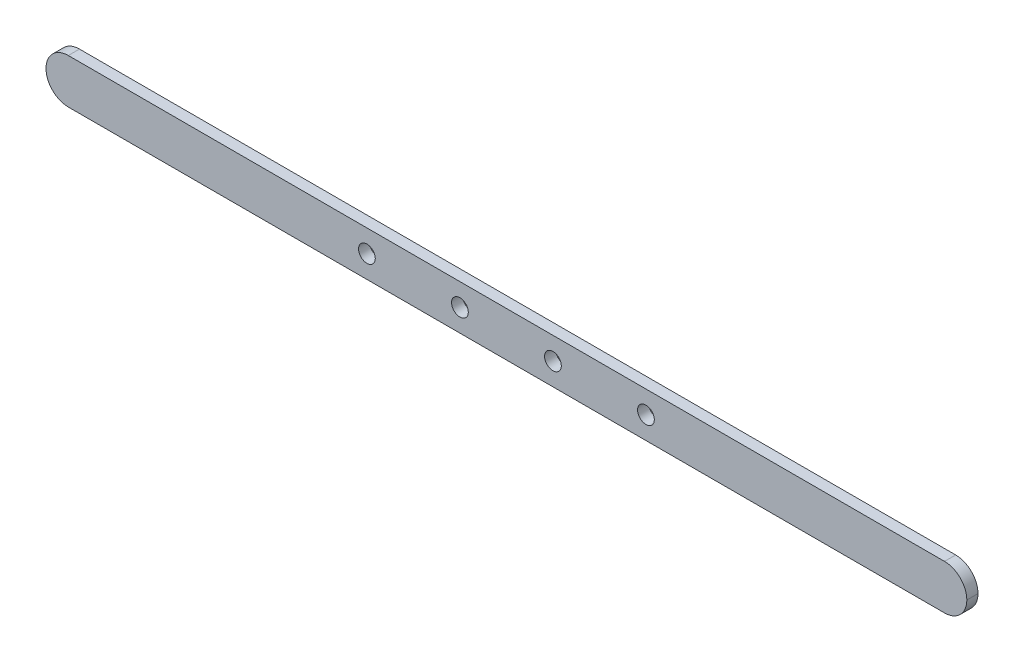
ISO-10303-21;
HEADER;
FILE_DESCRIPTION(('STEP AP214'),'2;1');
FILE_NAME('part.step','',(''),(''),'','','');
FILE_SCHEMA(('AUTOMOTIVE_DESIGN { 1 0 10303 214 1 1 1 1 }'));
ENDSEC;
DATA;
#1=APPLICATION_CONTEXT('core data for automotive mechanical design processes');
#2=APPLICATION_PROTOCOL_DEFINITION('international standard','automotive_design',2000,#1);
#3=PRODUCT_CONTEXT('',#1,'mechanical');
#4=PRODUCT('Part','Part','',(#3));
#5=PRODUCT_RELATED_PRODUCT_CATEGORY('part','',(#4));
#6=PRODUCT_DEFINITION_FORMATION('','',#4);
#7=PRODUCT_DEFINITION_CONTEXT('part definition',#1,'design');
#8=PRODUCT_DEFINITION('design','',#6,#7);
#9=PRODUCT_DEFINITION_SHAPE('','',#8);
#10=(LENGTH_UNIT() NAMED_UNIT(*) SI_UNIT(.MILLI.,.METRE.));
#11=(NAMED_UNIT(*) PLANE_ANGLE_UNIT() SI_UNIT($,.RADIAN.));
#12=(NAMED_UNIT(*) SI_UNIT($,.STERADIAN.) SOLID_ANGLE_UNIT());
#13=UNCERTAINTY_MEASURE_WITH_UNIT(LENGTH_MEASURE(1.E-05),#10,'distance_accuracy_value','');
#14=(GEOMETRIC_REPRESENTATION_CONTEXT(3) GLOBAL_UNCERTAINTY_ASSIGNED_CONTEXT((#13)) GLOBAL_UNIT_ASSIGNED_CONTEXT((#10,
#11,#12)) REPRESENTATION_CONTEXT('',''));
#15=CARTESIAN_POINT('',(0.,0.,0.));
#16=DIRECTION('',(0.,0.,1.));
#17=DIRECTION('',(1.,0.,0.));
#18=AXIS2_PLACEMENT_3D('',#15,#16,#17);
#19=CARTESIAN_POINT('',(0.,-12.,6.));
#20=DIRECTION('',(0.,1.,0.));
#21=DIRECTION('',(0.,0.,1.));
#22=AXIS2_PLACEMENT_3D('',#19,#20,#21);
#23=PLANE('',#22);
#24=DIRECTION('',(1.,0.,0.));
#25=VECTOR('',#24,1.);
#26=CARTESIAN_POINT('',(0.,-12.,6.));
#27=LINE('',#26,#25);
#28=CARTESIAN_POINT('',(-235.5,-12.,6.));
#29=VERTEX_POINT('',#28);
#30=CARTESIAN_POINT('',(235.5,-12.,6.));
#31=VERTEX_POINT('',#30);
#32=EDGE_CURVE('E121',#29,#31,#27,.T.);
#33=ORIENTED_EDGE('',*,*,#32,.F.);
#34=DIRECTION('',(0.,0.,-1.));
#35=VECTOR('',#34,1.);
#36=CARTESIAN_POINT('',(-235.5,-12.,0.));
#37=LINE('',#36,#35);
#38=CARTESIAN_POINT('',(-235.5,-12.,0.));
#39=VERTEX_POINT('',#38);
#40=EDGE_CURVE('E106',#29,#39,#37,.T.);
#41=ORIENTED_EDGE('',*,*,#40,.T.);
#42=DIRECTION('',(1.,0.,0.));
#43=VECTOR('',#42,1.);
#44=CARTESIAN_POINT('',(0.,-12.,0.));
#45=LINE('',#44,#43);
#46=CARTESIAN_POINT('',(235.5,-12.,0.));
#47=VERTEX_POINT('',#46);
#48=EDGE_CURVE('E118',#39,#47,#45,.T.);
#49=ORIENTED_EDGE('',*,*,#48,.T.);
#50=DIRECTION('',(0.,0.,-1.));
#51=VECTOR('',#50,1.);
#52=CARTESIAN_POINT('',(235.5,-12.,6.));
#53=LINE('',#52,#51);
#54=EDGE_CURVE('E124',#47,#31,#53,.F.);
#55=ORIENTED_EDGE('',*,*,#54,.T.);
#56=EDGE_LOOP('',(#33,#41,#49,#55));
#57=FACE_BOUND('',#56,.T.);
#58=ADVANCED_FACE('F47',(#57),#23,.F.);
#59=CARTESIAN_POINT('',(0.,12.,6.));
#60=DIRECTION('',(0.,1.,0.));
#61=DIRECTION('',(0.,0.,1.));
#62=AXIS2_PLACEMENT_3D('',#59,#60,#61);
#63=PLANE('',#62);
#64=DIRECTION('',(1.,0.,0.));
#65=VECTOR('',#64,1.);
#66=CARTESIAN_POINT('',(0.,12.,0.));
#67=LINE('',#66,#65);
#68=CARTESIAN_POINT('',(-235.5,12.,0.));
#69=VERTEX_POINT('',#68);
#70=CARTESIAN_POINT('',(235.5,12.,0.));
#71=VERTEX_POINT('',#70);
#72=EDGE_CURVE('E129',#69,#71,#67,.T.);
#73=ORIENTED_EDGE('',*,*,#72,.F.);
#74=DIRECTION('',(0.,0.,-1.));
#75=VECTOR('',#74,1.);
#76=CARTESIAN_POINT('',(-235.5,12.,6.));
#77=LINE('',#76,#75);
#78=CARTESIAN_POINT('',(-235.5,12.,6.));
#79=VERTEX_POINT('',#78);
#80=EDGE_CURVE('E11',#69,#79,#77,.F.);
#81=ORIENTED_EDGE('',*,*,#80,.T.);
#82=DIRECTION('',(1.,0.,0.));
#83=VECTOR('',#82,1.);
#84=CARTESIAN_POINT('',(0.,12.,6.));
#85=LINE('',#84,#83);
#86=CARTESIAN_POINT('',(235.5,12.,6.));
#87=VERTEX_POINT('',#86);
#88=EDGE_CURVE('E143',#79,#87,#85,.T.);
#89=ORIENTED_EDGE('',*,*,#88,.T.);
#90=DIRECTION('',(0.,0.,-1.));
#91=VECTOR('',#90,1.);
#92=CARTESIAN_POINT('',(235.5,12.,0.));
#93=LINE('',#92,#91);
#94=EDGE_CURVE('E57',#87,#71,#93,.T.);
#95=ORIENTED_EDGE('',*,*,#94,.T.);
#96=EDGE_LOOP('',(#73,#81,#89,#95));
#97=FACE_BOUND('',#96,.T.);
#98=ADVANCED_FACE('F210',(#97),#63,.T.);
#99=CARTESIAN_POINT('',(-25.,-7.00030991244604E-13,6.));
#100=DIRECTION('',(0.,0.,-1.));
#101=DIRECTION('',(-1.,0.,0.));
#102=AXIS2_PLACEMENT_3D('',#99,#100,#101);
#103=CYLINDRICAL_SURFACE('',#102,4.5);
#104=CARTESIAN_POINT('',(-25.,-7.00030991244604E-13,6.));
#105=DIRECTION('',(0.,0.,1.));
#106=DIRECTION('',(1.,0.,0.));
#107=AXIS2_PLACEMENT_3D('',#104,#105,#106);
#108=CIRCLE('',#107,4.5);
#109=CARTESIAN_POINT('',(-20.5,-7.00030991244604E-13,6.));
#110=VERTEX_POINT('',#109);
#111=EDGE_CURVE('E179',#110,#110,#108,.T.);
#112=ORIENTED_EDGE('',*,*,#111,.T.);
#113=EDGE_LOOP('',(#112));
#114=FACE_BOUND('',#113,.T.);
#115=CARTESIAN_POINT('',(-25.,-7.00030991244604E-13,0.));
#116=DIRECTION('',(0.,0.,1.));
#117=DIRECTION('',(1.,0.,0.));
#118=AXIS2_PLACEMENT_3D('',#115,#116,#117);
#119=CIRCLE('',#118,4.5);
#120=CARTESIAN_POINT('',(-20.5,-7.00030991244604E-13,0.));
#121=VERTEX_POINT('',#120);
#122=EDGE_CURVE('E130',#121,#121,#119,.T.);
#123=ORIENTED_EDGE('',*,*,#122,.F.);
#124=EDGE_LOOP('',(#123));
#125=FACE_BOUND('',#124,.T.);
#126=ADVANCED_FACE('F200',(#114,#125),#103,.F.);
#127=CARTESIAN_POINT('',(-75.,-1.04917912512892E-12,6.));
#128=DIRECTION('',(0.,0.,-1.));
#129=DIRECTION('',(-1.,0.,0.));
#130=AXIS2_PLACEMENT_3D('',#127,#128,#129);
#131=CYLINDRICAL_SURFACE('',#130,4.5);
#132=CARTESIAN_POINT('',(-75.,-1.04917912512892E-12,6.));
#133=DIRECTION('',(0.,0.,1.));
#134=DIRECTION('',(1.,0.,0.));
#135=AXIS2_PLACEMENT_3D('',#132,#133,#134);
#136=CIRCLE('',#135,4.5);
#137=CARTESIAN_POINT('',(-70.5,-1.04917912512892E-12,6.));
#138=VERTEX_POINT('',#137);
#139=EDGE_CURVE('E185',#138,#138,#136,.T.);
#140=ORIENTED_EDGE('',*,*,#139,.T.);
#141=EDGE_LOOP('',(#140));
#142=FACE_BOUND('',#141,.T.);
#143=CARTESIAN_POINT('',(-75.,-1.04917912512892E-12,0.));
#144=DIRECTION('',(0.,0.,1.));
#145=DIRECTION('',(1.,0.,0.));
#146=AXIS2_PLACEMENT_3D('',#143,#144,#145);
#147=CIRCLE('',#146,4.5);
#148=CARTESIAN_POINT('',(-70.5,-1.04917912512892E-12,0.));
#149=VERTEX_POINT('',#148);
#150=EDGE_CURVE('E138',#149,#149,#147,.T.);
#151=ORIENTED_EDGE('',*,*,#150,.F.);
#152=EDGE_LOOP('',(#151));
#153=FACE_BOUND('',#152,.T.);
#154=ADVANCED_FACE('F197',(#142,#153),#131,.F.);
#155=CARTESIAN_POINT('',(25.,-3.5088285736029E-13,6.));
#156=DIRECTION('',(0.,0.,-1.));
#157=DIRECTION('',(-1.,0.,0.));
#158=AXIS2_PLACEMENT_3D('',#155,#156,#157);
#159=CYLINDRICAL_SURFACE('',#158,4.5);
#160=CARTESIAN_POINT('',(25.,-3.5088285736029E-13,6.));
#161=DIRECTION('',(0.,0.,1.));
#162=DIRECTION('',(1.,0.,0.));
#163=AXIS2_PLACEMENT_3D('',#160,#161,#162);
#164=CIRCLE('',#163,4.5);
#165=CARTESIAN_POINT('',(29.5,-3.5088285736029E-13,6.));
#166=VERTEX_POINT('',#165);
#167=EDGE_CURVE('E239',#166,#166,#164,.T.);
#168=ORIENTED_EDGE('',*,*,#167,.T.);
#169=EDGE_LOOP('',(#168));
#170=FACE_BOUND('',#169,.T.);
#171=CARTESIAN_POINT('',(25.,-3.5088285736029E-13,0.));
#172=DIRECTION('',(0.,0.,1.));
#173=DIRECTION('',(1.,0.,0.));
#174=AXIS2_PLACEMENT_3D('',#171,#172,#173);
#175=CIRCLE('',#174,4.5);
#176=CARTESIAN_POINT('',(29.5,-3.5088285736029E-13,0.));
#177=VERTEX_POINT('',#176);
#178=EDGE_CURVE('E168',#177,#177,#175,.T.);
#179=ORIENTED_EDGE('',*,*,#178,.F.);
#180=EDGE_LOOP('',(#179));
#181=FACE_BOUND('',#180,.T.);
#182=ADVANCED_FACE('F199',(#170,#181),#159,.F.);
#183=CARTESIAN_POINT('',(75.,0.,6.));
#184=DIRECTION('',(0.,0.,-1.));
#185=DIRECTION('',(-1.,0.,0.));
#186=AXIS2_PLACEMENT_3D('',#183,#184,#185);
#187=CYLINDRICAL_SURFACE('',#186,4.5);
#188=CARTESIAN_POINT('',(75.,0.,6.));
#189=DIRECTION('',(0.,0.,1.));
#190=DIRECTION('',(1.,0.,0.));
#191=AXIS2_PLACEMENT_3D('',#188,#189,#190);
#192=CIRCLE('',#191,4.5);
#193=CARTESIAN_POINT('',(79.5,0.,6.));
#194=VERTEX_POINT('',#193);
#195=EDGE_CURVE('E135',#194,#194,#192,.T.);
#196=ORIENTED_EDGE('',*,*,#195,.T.);
#197=EDGE_LOOP('',(#196));
#198=FACE_BOUND('',#197,.T.);
#199=CARTESIAN_POINT('',(75.,0.,0.));
#200=DIRECTION('',(0.,0.,1.));
#201=DIRECTION('',(1.,0.,0.));
#202=AXIS2_PLACEMENT_3D('',#199,#200,#201);
#203=CIRCLE('',#202,4.5);
#204=CARTESIAN_POINT('',(79.5,0.,0.));
#205=VERTEX_POINT('',#204);
#206=EDGE_CURVE('E164',#205,#205,#203,.T.);
#207=ORIENTED_EDGE('',*,*,#206,.F.);
#208=EDGE_LOOP('',(#207));
#209=FACE_BOUND('',#208,.T.);
#210=ADVANCED_FACE('F207',(#198,#209),#187,.F.);
#211=CARTESIAN_POINT('',(0.,0.,6.));
#212=DIRECTION('',(0.,0.,1.));
#213=DIRECTION('',(1.,0.,0.));
#214=AXIS2_PLACEMENT_3D('',#211,#212,#213);
#215=PLANE('',#214);
#216=ORIENTED_EDGE('',*,*,#195,.F.);
#217=EDGE_LOOP('',(#216));
#218=FACE_BOUND('',#217,.T.);
#219=ORIENTED_EDGE('',*,*,#167,.F.);
#220=EDGE_LOOP('',(#219));
#221=FACE_BOUND('',#220,.T.);
#222=ORIENTED_EDGE('',*,*,#139,.F.);
#223=EDGE_LOOP('',(#222));
#224=FACE_BOUND('',#223,.T.);
#225=ORIENTED_EDGE('',*,*,#111,.F.);
#226=EDGE_LOOP('',(#225));
#227=FACE_BOUND('',#226,.T.);
#228=CARTESIAN_POINT('',(-235.5,0.,6.));
#229=DIRECTION('',(0.,0.,1.));
#230=DIRECTION('',(1.,0.,0.));
#231=AXIS2_PLACEMENT_3D('',#228,#229,#230);
#232=CIRCLE('',#231,12.);
#233=CARTESIAN_POINT('',(-247.5,0.,6.));
#234=VERTEX_POINT('',#233);
#235=EDGE_CURVE('E65',#79,#234,#232,.T.);
#236=ORIENTED_EDGE('',*,*,#235,.T.);
#237=CARTESIAN_POINT('',(-235.5,0.,6.));
#238=DIRECTION('',(0.,0.,1.));
#239=DIRECTION('',(1.,0.,0.));
#240=AXIS2_PLACEMENT_3D('',#237,#238,#239);
#241=CIRCLE('',#240,12.);
#242=EDGE_CURVE('E158',#234,#29,#241,.T.);
#243=ORIENTED_EDGE('',*,*,#242,.T.);
#244=ORIENTED_EDGE('',*,*,#32,.T.);
#245=CARTESIAN_POINT('',(235.5,0.,6.));
#246=DIRECTION('',(0.,0.,1.));
#247=DIRECTION('',(1.,0.,0.));
#248=AXIS2_PLACEMENT_3D('',#245,#246,#247);
#249=CIRCLE('',#248,12.);
#250=CARTESIAN_POINT('',(247.5,0.,6.));
#251=VERTEX_POINT('',#250);
#252=EDGE_CURVE('E112',#31,#251,#249,.T.);
#253=ORIENTED_EDGE('',*,*,#252,.T.);
#254=CARTESIAN_POINT('',(235.5,0.,6.));
#255=DIRECTION('',(0.,0.,1.));
#256=DIRECTION('',(1.,0.,0.));
#257=AXIS2_PLACEMENT_3D('',#254,#255,#256);
#258=CIRCLE('',#257,12.);
#259=EDGE_CURVE('E71',#251,#87,#258,.T.);
#260=ORIENTED_EDGE('',*,*,#259,.T.);
#261=ORIENTED_EDGE('',*,*,#88,.F.);
#262=EDGE_LOOP('',(#236,#243,#244,#253,#260,#261));
#263=FACE_BOUND('',#262,.T.);
#264=ADVANCED_FACE('F177',(#218,#221,#224,#227,#263),#215,.T.);
#265=CARTESIAN_POINT('',(0.,0.,0.));
#266=DIRECTION('',(0.,0.,1.));
#267=DIRECTION('',(1.,0.,0.));
#268=AXIS2_PLACEMENT_3D('',#265,#266,#267);
#269=PLANE('',#268);
#270=ORIENTED_EDGE('',*,*,#206,.T.);
#271=EDGE_LOOP('',(#270));
#272=FACE_BOUND('',#271,.T.);
#273=ORIENTED_EDGE('',*,*,#178,.T.);
#274=EDGE_LOOP('',(#273));
#275=FACE_BOUND('',#274,.T.);
#276=ORIENTED_EDGE('',*,*,#150,.T.);
#277=EDGE_LOOP('',(#276));
#278=FACE_BOUND('',#277,.T.);
#279=ORIENTED_EDGE('',*,*,#122,.T.);
#280=EDGE_LOOP('',(#279));
#281=FACE_BOUND('',#280,.T.);
#282=ORIENTED_EDGE('',*,*,#48,.F.);
#283=CARTESIAN_POINT('',(-235.5,0.,0.));
#284=DIRECTION('',(0.,0.,1.));
#285=DIRECTION('',(1.,0.,0.));
#286=AXIS2_PLACEMENT_3D('',#283,#284,#285);
#287=CIRCLE('',#286,12.);
#288=CARTESIAN_POINT('',(-247.5,0.,0.));
#289=VERTEX_POINT('',#288);
#290=EDGE_CURVE('E102',#39,#289,#287,.F.);
#291=ORIENTED_EDGE('',*,*,#290,.T.);
#292=CARTESIAN_POINT('',(-235.5,0.,0.));
#293=DIRECTION('',(0.,0.,1.));
#294=DIRECTION('',(1.,0.,0.));
#295=AXIS2_PLACEMENT_3D('',#292,#293,#294);
#296=CIRCLE('',#295,12.);
#297=EDGE_CURVE('E113',#289,#69,#296,.F.);
#298=ORIENTED_EDGE('',*,*,#297,.T.);
#299=ORIENTED_EDGE('',*,*,#72,.T.);
#300=CARTESIAN_POINT('',(235.5,0.,0.));
#301=DIRECTION('',(0.,0.,1.));
#302=DIRECTION('',(1.,0.,0.));
#303=AXIS2_PLACEMENT_3D('',#300,#301,#302);
#304=CIRCLE('',#303,12.);
#305=CARTESIAN_POINT('',(247.5,0.,0.));
#306=VERTEX_POINT('',#305);
#307=EDGE_CURVE('E147',#71,#306,#304,.F.);
#308=ORIENTED_EDGE('',*,*,#307,.T.);
#309=CARTESIAN_POINT('',(235.5,0.,0.));
#310=DIRECTION('',(0.,0.,1.));
#311=DIRECTION('',(1.,0.,0.));
#312=AXIS2_PLACEMENT_3D('',#309,#310,#311);
#313=CIRCLE('',#312,12.);
#314=EDGE_CURVE('E123',#306,#47,#313,.F.);
#315=ORIENTED_EDGE('',*,*,#314,.T.);
#316=EDGE_LOOP('',(#282,#291,#298,#299,#308,#315));
#317=FACE_BOUND('',#316,.T.);
#318=ADVANCED_FACE('F126',(#272,#275,#278,#281,#317),#269,.F.);
#319=CARTESIAN_POINT('',(-235.5,0.,6.));
#320=DIRECTION('',(0.,0.,-1.));
#321=DIRECTION('',(-1.,0.,0.));
#322=AXIS2_PLACEMENT_3D('',#319,#320,#321);
#323=CYLINDRICAL_SURFACE('',#322,12.);
#324=DIRECTION('',(0.,0.,-1.));
#325=VECTOR('',#324,1.);
#326=CARTESIAN_POINT('',(-247.5,0.,6.));
#327=LINE('',#326,#325);
#328=EDGE_CURVE('E107',#234,#289,#327,.T.);
#329=ORIENTED_EDGE('',*,*,#328,.F.);
#330=ORIENTED_EDGE('',*,*,#235,.F.);
#331=ORIENTED_EDGE('',*,*,#80,.F.);
#332=ORIENTED_EDGE('',*,*,#297,.F.);
#333=EDGE_LOOP('',(#329,#330,#331,#332));
#334=FACE_BOUND('',#333,.T.);
#335=ADVANCED_FACE('F225',(#334),#323,.T.);
#336=CARTESIAN_POINT('',(-235.5,0.,6.));
#337=DIRECTION('',(0.,0.,1.));
#338=DIRECTION('',(1.,0.,0.));
#339=AXIS2_PLACEMENT_3D('',#336,#337,#338);
#340=CYLINDRICAL_SURFACE('',#339,12.);
#341=ORIENTED_EDGE('',*,*,#242,.F.);
#342=ORIENTED_EDGE('',*,*,#328,.T.);
#343=ORIENTED_EDGE('',*,*,#290,.F.);
#344=ORIENTED_EDGE('',*,*,#40,.F.);
#345=EDGE_LOOP('',(#341,#342,#343,#344));
#346=FACE_BOUND('',#345,.T.);
#347=ADVANCED_FACE('F105',(#346),#340,.T.);
#348=CARTESIAN_POINT('',(235.5,0.,6.));
#349=DIRECTION('',(0.,0.,-1.));
#350=DIRECTION('',(-1.,0.,0.));
#351=AXIS2_PLACEMENT_3D('',#348,#349,#350);
#352=CYLINDRICAL_SURFACE('',#351,12.);
#353=DIRECTION('',(0.,0.,-1.));
#354=VECTOR('',#353,1.);
#355=CARTESIAN_POINT('',(247.5,0.,6.));
#356=LINE('',#355,#354);
#357=EDGE_CURVE('E51',#251,#306,#356,.T.);
#358=ORIENTED_EDGE('',*,*,#357,.F.);
#359=ORIENTED_EDGE('',*,*,#252,.F.);
#360=ORIENTED_EDGE('',*,*,#54,.F.);
#361=ORIENTED_EDGE('',*,*,#314,.F.);
#362=EDGE_LOOP('',(#358,#359,#360,#361));
#363=FACE_BOUND('',#362,.T.);
#364=ADVANCED_FACE('F49',(#363),#352,.T.);
#365=CARTESIAN_POINT('',(235.5,0.,6.));
#366=DIRECTION('',(0.,0.,1.));
#367=DIRECTION('',(1.,0.,0.));
#368=AXIS2_PLACEMENT_3D('',#365,#366,#367);
#369=CYLINDRICAL_SURFACE('',#368,12.);
#370=ORIENTED_EDGE('',*,*,#259,.F.);
#371=ORIENTED_EDGE('',*,*,#357,.T.);
#372=ORIENTED_EDGE('',*,*,#307,.F.);
#373=ORIENTED_EDGE('',*,*,#94,.F.);
#374=EDGE_LOOP('',(#370,#371,#372,#373));
#375=FACE_BOUND('',#374,.T.);
#376=ADVANCED_FACE('F173',(#375),#369,.T.);
#377=CLOSED_SHELL('',(#58,#98,#126,#154,#182,#210,#264,#318,#335,#347,#364,#376));
#378=MANIFOLD_SOLID_BREP('B2',#377);
#379=ADVANCED_BREP_SHAPE_REPRESENTATION('',(#18,#378),#14);
#380=SHAPE_DEFINITION_REPRESENTATION(#9,#379);
ENDSEC;
END-ISO-10303-21;
